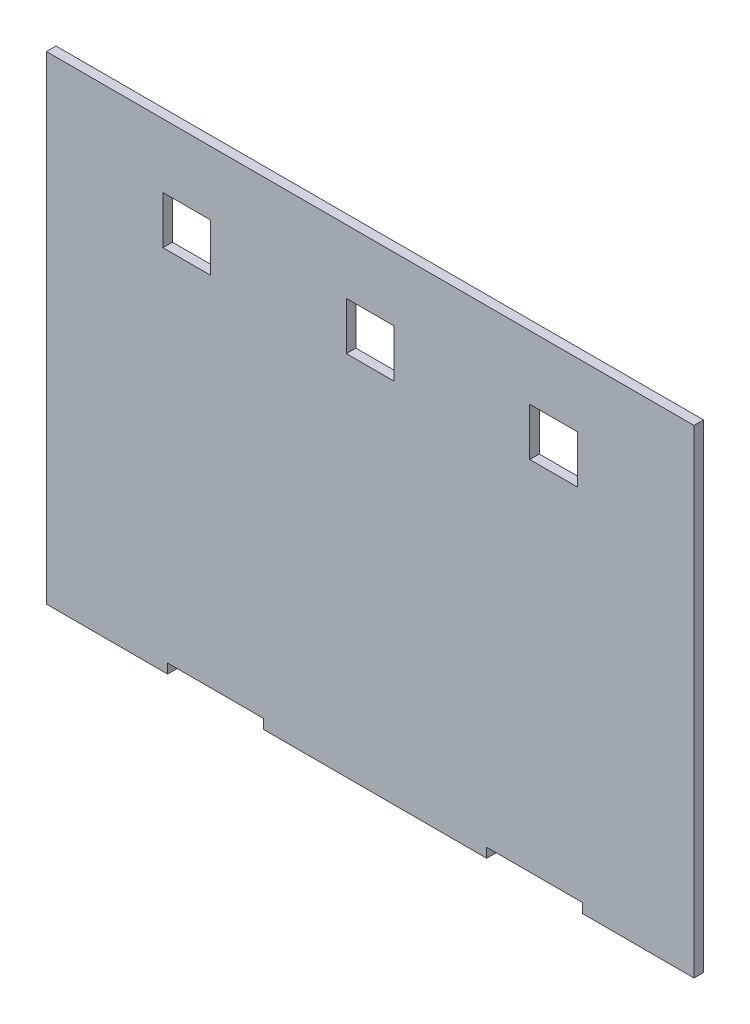
ISO-10303-21;
HEADER;
FILE_DESCRIPTION(('STEP AP214'),'2;1');
FILE_NAME('part.step','',(''),(''),'','','');
FILE_SCHEMA(('AUTOMOTIVE_DESIGN { 1 0 10303 214 1 1 1 1 }'));
ENDSEC;
DATA;
#1=APPLICATION_CONTEXT('core data for automotive mechanical design processes');
#2=APPLICATION_PROTOCOL_DEFINITION('international standard','automotive_design',2000,#1);
#3=PRODUCT_CONTEXT('',#1,'mechanical');
#4=PRODUCT('Part','Part','',(#3));
#5=PRODUCT_RELATED_PRODUCT_CATEGORY('part','',(#4));
#6=PRODUCT_DEFINITION_FORMATION('','',#4);
#7=PRODUCT_DEFINITION_CONTEXT('part definition',#1,'design');
#8=PRODUCT_DEFINITION('design','',#6,#7);
#9=PRODUCT_DEFINITION_SHAPE('','',#8);
#10=(LENGTH_UNIT() NAMED_UNIT(*) SI_UNIT(.MILLI.,.METRE.));
#11=(NAMED_UNIT(*) PLANE_ANGLE_UNIT() SI_UNIT($,.RADIAN.));
#12=(NAMED_UNIT(*) SI_UNIT($,.STERADIAN.) SOLID_ANGLE_UNIT());
#13=UNCERTAINTY_MEASURE_WITH_UNIT(LENGTH_MEASURE(1.E-05),#10,'distance_accuracy_value','');
#14=(GEOMETRIC_REPRESENTATION_CONTEXT(3) GLOBAL_UNCERTAINTY_ASSIGNED_CONTEXT((#13)) GLOBAL_UNIT_ASSIGNED_CONTEXT((#10,
#11,#12)) REPRESENTATION_CONTEXT('',''));
#15=CARTESIAN_POINT('',(0.,0.,0.));
#16=DIRECTION('',(0.,0.,1.));
#17=DIRECTION('',(1.,0.,0.));
#18=AXIS2_PLACEMENT_3D('',#15,#16,#17);
#19=CARTESIAN_POINT('',(-101.5,-75.,3.));
#20=DIRECTION('',(0.,1.,0.));
#21=DIRECTION('',(0.,0.,1.));
#22=AXIS2_PLACEMENT_3D('',#19,#20,#21);
#23=PLANE('',#22);
#24=DIRECTION('',(1.,0.,0.));
#25=VECTOR('',#24,1.);
#26=CARTESIAN_POINT('',(-101.5,-75.,0.));
#27=LINE('',#26,#25);
#28=CARTESIAN_POINT('',(-101.5,-75.,0.));
#29=VERTEX_POINT('',#28);
#30=CARTESIAN_POINT('',(-63.5,-75.,0.));
#31=VERTEX_POINT('',#30);
#32=EDGE_CURVE('E219',#29,#31,#27,.T.);
#33=ORIENTED_EDGE('',*,*,#32,.T.);
#34=DIRECTION('',(0.,0.,1.));
#35=VECTOR('',#34,1.);
#36=CARTESIAN_POINT('',(-63.5,-75.,-7.));
#37=LINE('',#36,#35);
#38=CARTESIAN_POINT('',(-63.5,-75.,3.));
#39=VERTEX_POINT('',#38);
#40=EDGE_CURVE('E202',#31,#39,#37,.T.);
#41=ORIENTED_EDGE('',*,*,#40,.T.);
#42=DIRECTION('',(1.,0.,0.));
#43=VECTOR('',#42,1.);
#44=CARTESIAN_POINT('',(-101.5,-75.,3.));
#45=LINE('',#44,#43);
#46=CARTESIAN_POINT('',(-101.5,-75.,3.));
#47=VERTEX_POINT('',#46);
#48=EDGE_CURVE('E217',#47,#39,#45,.T.);
#49=ORIENTED_EDGE('',*,*,#48,.F.);
#50=DIRECTION('',(0.,0.,-1.));
#51=VECTOR('',#50,1.);
#52=CARTESIAN_POINT('',(-101.5,-75.,3.));
#53=LINE('',#52,#51);
#54=EDGE_CURVE('E237',#47,#29,#53,.T.);
#55=ORIENTED_EDGE('',*,*,#54,.T.);
#56=EDGE_LOOP('',(#33,#41,#49,#55));
#57=FACE_BOUND('',#56,.T.);
#58=ADVANCED_FACE('F38',(#57),#23,.F.);
#59=CARTESIAN_POINT('',(-33.5,-75.,3.));
#60=VERTEX_POINT('',#59);
#61=CARTESIAN_POINT('',(36.5,-74.9999999999999,3.));
#62=VERTEX_POINT('',#61);
#63=EDGE_CURVE('E231',#60,#62,#45,.T.);
#64=ORIENTED_EDGE('',*,*,#63,.F.);
#65=DIRECTION('',(0.,0.,1.));
#66=VECTOR('',#65,1.);
#67=CARTESIAN_POINT('',(-33.5,-75.,-7.));
#68=LINE('',#67,#66);
#69=CARTESIAN_POINT('',(-33.5,-75.,0.));
#70=VERTEX_POINT('',#69);
#71=EDGE_CURVE('E221',#70,#60,#68,.T.);
#72=ORIENTED_EDGE('',*,*,#71,.F.);
#73=CARTESIAN_POINT('',(36.5,-74.9999999999999,0.));
#74=VERTEX_POINT('',#73);
#75=EDGE_CURVE('E433',#70,#74,#27,.T.);
#76=ORIENTED_EDGE('',*,*,#75,.T.);
#77=DIRECTION('',(0.,0.,1.));
#78=VECTOR('',#77,1.);
#79=CARTESIAN_POINT('',(36.5,-74.9999999999999,-7.));
#80=LINE('',#79,#78);
#81=EDGE_CURVE('E211',#74,#62,#80,.T.);
#82=ORIENTED_EDGE('',*,*,#81,.T.);
#83=EDGE_LOOP('',(#64,#72,#76,#82));
#84=FACE_BOUND('',#83,.T.);
#85=ADVANCED_FACE('F489',(#84),#23,.F.);
#86=CARTESIAN_POINT('',(101.5,75.,3.));
#87=DIRECTION('',(-1.,0.,0.));
#88=DIRECTION('',(0.,-1.,0.));
#89=AXIS2_PLACEMENT_3D('',#86,#87,#88);
#90=PLANE('',#89);
#91=DIRECTION('',(0.,1.,0.));
#92=VECTOR('',#91,1.);
#93=CARTESIAN_POINT('',(101.5,75.,0.));
#94=LINE('',#93,#92);
#95=CARTESIAN_POINT('',(101.5,-75.,0.));
#96=VERTEX_POINT('',#95);
#97=CARTESIAN_POINT('',(101.5,75.,0.));
#98=VERTEX_POINT('',#97);
#99=EDGE_CURVE('E358',#96,#98,#94,.T.);
#100=ORIENTED_EDGE('',*,*,#99,.T.);
#101=DIRECTION('',(0.,0.,-1.));
#102=VECTOR('',#101,1.);
#103=CARTESIAN_POINT('',(101.5,75.,3.));
#104=LINE('',#103,#102);
#105=CARTESIAN_POINT('',(101.5,75.,3.));
#106=VERTEX_POINT('',#105);
#107=EDGE_CURVE('E448',#106,#98,#104,.T.);
#108=ORIENTED_EDGE('',*,*,#107,.F.);
#109=DIRECTION('',(0.,1.,0.));
#110=VECTOR('',#109,1.);
#111=CARTESIAN_POINT('',(101.5,75.,3.));
#112=LINE('',#111,#110);
#113=CARTESIAN_POINT('',(101.5,-75.,3.));
#114=VERTEX_POINT('',#113);
#115=EDGE_CURVE('E250',#114,#106,#112,.T.);
#116=ORIENTED_EDGE('',*,*,#115,.F.);
#117=DIRECTION('',(0.,0.,-1.));
#118=VECTOR('',#117,1.);
#119=CARTESIAN_POINT('',(101.5,-75.,3.));
#120=LINE('',#119,#118);
#121=EDGE_CURVE('E230',#114,#96,#120,.T.);
#122=ORIENTED_EDGE('',*,*,#121,.T.);
#123=EDGE_LOOP('',(#100,#108,#116,#122));
#124=FACE_BOUND('',#123,.T.);
#125=ADVANCED_FACE('F40',(#124),#90,.F.);
#126=CARTESIAN_POINT('',(-101.5,75.,3.));
#127=DIRECTION('',(0.,-1.,0.));
#128=DIRECTION('',(0.,0.,-1.));
#129=AXIS2_PLACEMENT_3D('',#126,#127,#128);
#130=PLANE('',#129);
#131=DIRECTION('',(-1.,0.,0.));
#132=VECTOR('',#131,1.);
#133=CARTESIAN_POINT('',(-101.5,75.,0.));
#134=LINE('',#133,#132);
#135=CARTESIAN_POINT('',(-101.5,75.,0.));
#136=VERTEX_POINT('',#135);
#137=EDGE_CURVE('E464',#98,#136,#134,.T.);
#138=ORIENTED_EDGE('',*,*,#137,.T.);
#139=DIRECTION('',(0.,0.,-1.));
#140=VECTOR('',#139,1.);
#141=CARTESIAN_POINT('',(-101.5,75.,3.));
#142=LINE('',#141,#140);
#143=CARTESIAN_POINT('',(-101.5,75.,3.));
#144=VERTEX_POINT('',#143);
#145=EDGE_CURVE('E452',#144,#136,#142,.T.);
#146=ORIENTED_EDGE('',*,*,#145,.F.);
#147=DIRECTION('',(-1.,0.,0.));
#148=VECTOR('',#147,1.);
#149=CARTESIAN_POINT('',(-101.5,75.,3.));
#150=LINE('',#149,#148);
#151=EDGE_CURVE('E248',#106,#144,#150,.T.);
#152=ORIENTED_EDGE('',*,*,#151,.F.);
#153=ORIENTED_EDGE('',*,*,#107,.T.);
#154=EDGE_LOOP('',(#138,#146,#152,#153));
#155=FACE_BOUND('',#154,.T.);
#156=ADVANCED_FACE('F476',(#155),#130,.F.);
#157=CARTESIAN_POINT('',(-101.5,75.,3.));
#158=DIRECTION('',(1.,0.,0.));
#159=DIRECTION('',(0.,1.,0.));
#160=AXIS2_PLACEMENT_3D('',#157,#158,#159);
#161=PLANE('',#160);
#162=DIRECTION('',(0.,-1.,0.));
#163=VECTOR('',#162,1.);
#164=CARTESIAN_POINT('',(-101.5,75.,0.));
#165=LINE('',#164,#163);
#166=EDGE_CURVE('E461',#136,#29,#165,.T.);
#167=ORIENTED_EDGE('',*,*,#166,.T.);
#168=ORIENTED_EDGE('',*,*,#54,.F.);
#169=DIRECTION('',(0.,-1.,0.));
#170=VECTOR('',#169,1.);
#171=CARTESIAN_POINT('',(-101.5,75.,3.));
#172=LINE('',#171,#170);
#173=EDGE_CURVE('E227',#144,#47,#172,.T.);
#174=ORIENTED_EDGE('',*,*,#173,.F.);
#175=ORIENTED_EDGE('',*,*,#145,.T.);
#176=EDGE_LOOP('',(#167,#168,#174,#175));
#177=FACE_BOUND('',#176,.T.);
#178=ADVANCED_FACE('F478',(#177),#161,.F.);
#179=CARTESIAN_POINT('',(66.5,-74.9999999999999,3.));
#180=VERTEX_POINT('',#179);
#181=EDGE_CURVE('E233',#180,#114,#45,.T.);
#182=ORIENTED_EDGE('',*,*,#181,.F.);
#183=DIRECTION('',(0.,0.,1.));
#184=VECTOR('',#183,1.);
#185=CARTESIAN_POINT('',(66.5,-74.9999999999999,-7.));
#186=LINE('',#185,#184);
#187=CARTESIAN_POINT('',(66.5,-74.9999999999999,0.));
#188=VERTEX_POINT('',#187);
#189=EDGE_CURVE('E388',#188,#180,#186,.T.);
#190=ORIENTED_EDGE('',*,*,#189,.F.);
#191=EDGE_CURVE('E460',#188,#96,#27,.T.);
#192=ORIENTED_EDGE('',*,*,#191,.T.);
#193=ORIENTED_EDGE('',*,*,#121,.F.);
#194=EDGE_LOOP('',(#182,#190,#192,#193));
#195=FACE_BOUND('',#194,.T.);
#196=ADVANCED_FACE('F480',(#195),#23,.F.);
#197=CARTESIAN_POINT('',(0.,0.,3.));
#198=DIRECTION('',(0.,0.,1.));
#199=DIRECTION('',(1.,0.,0.));
#200=AXIS2_PLACEMENT_3D('',#197,#198,#199);
#201=PLANE('',#200);
#202=DIRECTION('',(0.,-1.,0.));
#203=VECTOR('',#202,1.);
#204=CARTESIAN_POINT('',(-63.5,-75.,3.));
#205=LINE('',#204,#203);
#206=CARTESIAN_POINT('',(-63.5,-72.0000000000002,3.));
#207=VERTEX_POINT('',#206);
#208=EDGE_CURVE('E199',#207,#39,#205,.T.);
#209=ORIENTED_EDGE('',*,*,#208,.F.);
#210=DIRECTION('',(-1.,0.,0.));
#211=VECTOR('',#210,1.);
#212=CARTESIAN_POINT('',(-63.5,-72.0000000000002,3.));
#213=LINE('',#212,#211);
#214=CARTESIAN_POINT('',(-33.5,-72.0000000000002,3.));
#215=VERTEX_POINT('',#214);
#216=EDGE_CURVE('E222',#215,#207,#213,.T.);
#217=ORIENTED_EDGE('',*,*,#216,.F.);
#218=DIRECTION('',(0.,1.,0.));
#219=VECTOR('',#218,1.);
#220=CARTESIAN_POINT('',(-33.5,-75.,3.));
#221=LINE('',#220,#219);
#222=EDGE_CURVE('E210',#60,#215,#221,.T.);
#223=ORIENTED_EDGE('',*,*,#222,.F.);
#224=ORIENTED_EDGE('',*,*,#63,.T.);
#225=DIRECTION('',(0.,-1.,0.));
#226=VECTOR('',#225,1.);
#227=CARTESIAN_POINT('',(36.5,-74.9999999999999,3.));
#228=LINE('',#227,#226);
#229=CARTESIAN_POINT('',(36.5,-72.0000000000001,3.));
#230=VERTEX_POINT('',#229);
#231=EDGE_CURVE('E391',#230,#62,#228,.T.);
#232=ORIENTED_EDGE('',*,*,#231,.F.);
#233=DIRECTION('',(-1.,0.,0.));
#234=VECTOR('',#233,1.);
#235=CARTESIAN_POINT('',(36.5,-72.0000000000001,3.));
#236=LINE('',#235,#234);
#237=CARTESIAN_POINT('',(66.5,-72.0000000000001,3.));
#238=VERTEX_POINT('',#237);
#239=EDGE_CURVE('E402',#238,#230,#236,.T.);
#240=ORIENTED_EDGE('',*,*,#239,.F.);
#241=DIRECTION('',(0.,1.,0.));
#242=VECTOR('',#241,1.);
#243=CARTESIAN_POINT('',(66.5,-74.9999999999999,3.));
#244=LINE('',#243,#242);
#245=EDGE_CURVE('E406',#180,#238,#244,.T.);
#246=ORIENTED_EDGE('',*,*,#245,.F.);
#247=ORIENTED_EDGE('',*,*,#181,.T.);
#248=ORIENTED_EDGE('',*,*,#115,.T.);
#249=ORIENTED_EDGE('',*,*,#151,.T.);
#250=ORIENTED_EDGE('',*,*,#173,.T.);
#251=ORIENTED_EDGE('',*,*,#48,.T.);
#252=EDGE_LOOP('',(#209,#217,#223,#224,#232,#240,#246,#247,#248,#249,#250,#251));
#253=FACE_BOUND('',#252,.T.);
#254=DIRECTION('',(0.,-1.,0.));
#255=VECTOR('',#254,1.);
#256=CARTESIAN_POINT('',(-65.,55.,3.));
#257=LINE('',#256,#255);
#258=CARTESIAN_POINT('',(-65.,55.,3.));
#259=VERTEX_POINT('',#258);
#260=CARTESIAN_POINT('',(-65.,40.,3.));
#261=VERTEX_POINT('',#260);
#262=EDGE_CURVE('E314',#259,#261,#257,.T.);
#263=ORIENTED_EDGE('',*,*,#262,.F.);
#264=DIRECTION('',(-1.,0.,0.));
#265=VECTOR('',#264,1.);
#266=CARTESIAN_POINT('',(-65.,55.,3.));
#267=LINE('',#266,#265);
#268=CARTESIAN_POINT('',(-50.,55.,3.));
#269=VERTEX_POINT('',#268);
#270=EDGE_CURVE('E359',#269,#259,#267,.T.);
#271=ORIENTED_EDGE('',*,*,#270,.F.);
#272=DIRECTION('',(0.,1.,0.));
#273=VECTOR('',#272,1.);
#274=CARTESIAN_POINT('',(-50.,55.,3.));
#275=LINE('',#274,#273);
#276=CARTESIAN_POINT('',(-50.,40.,3.));
#277=VERTEX_POINT('',#276);
#278=EDGE_CURVE('E364',#277,#269,#275,.T.);
#279=ORIENTED_EDGE('',*,*,#278,.F.);
#280=DIRECTION('',(1.,0.,0.));
#281=VECTOR('',#280,1.);
#282=CARTESIAN_POINT('',(-65.,40.,3.));
#283=LINE('',#282,#281);
#284=EDGE_CURVE('E368',#261,#277,#283,.T.);
#285=ORIENTED_EDGE('',*,*,#284,.F.);
#286=EDGE_LOOP('',(#263,#271,#279,#285));
#287=FACE_BOUND('',#286,.T.);
#288=DIRECTION('',(0.,1.,0.));
#289=VECTOR('',#288,1.);
#290=CARTESIAN_POINT('',(65.,55.,3.));
#291=LINE('',#290,#289);
#292=CARTESIAN_POINT('',(65.,40.,3.));
#293=VERTEX_POINT('',#292);
#294=CARTESIAN_POINT('',(65.,55.,3.));
#295=VERTEX_POINT('',#294);
#296=EDGE_CURVE('E269',#293,#295,#291,.T.);
#297=ORIENTED_EDGE('',*,*,#296,.F.);
#298=DIRECTION('',(1.,0.,0.));
#299=VECTOR('',#298,1.);
#300=CARTESIAN_POINT('',(65.,40.,3.));
#301=LINE('',#300,#299);
#302=CARTESIAN_POINT('',(50.,40.,3.));
#303=VERTEX_POINT('',#302);
#304=EDGE_CURVE('E315',#303,#293,#301,.T.);
#305=ORIENTED_EDGE('',*,*,#304,.F.);
#306=DIRECTION('',(0.,-1.,0.));
#307=VECTOR('',#306,1.);
#308=CARTESIAN_POINT('',(50.,55.,3.));
#309=LINE('',#308,#307);
#310=CARTESIAN_POINT('',(50.,55.,3.));
#311=VERTEX_POINT('',#310);
#312=EDGE_CURVE('E320',#311,#303,#309,.T.);
#313=ORIENTED_EDGE('',*,*,#312,.F.);
#314=DIRECTION('',(-1.,0.,0.));
#315=VECTOR('',#314,1.);
#316=CARTESIAN_POINT('',(65.,55.,3.));
#317=LINE('',#316,#315);
#318=EDGE_CURVE('E324',#295,#311,#317,.T.);
#319=ORIENTED_EDGE('',*,*,#318,.F.);
#320=EDGE_LOOP('',(#297,#305,#313,#319));
#321=FACE_BOUND('',#320,.T.);
#322=DIRECTION('',(0.,1.,0.));
#323=VECTOR('',#322,1.);
#324=CARTESIAN_POINT('',(7.49999999999999,55.,3.));
#325=LINE('',#324,#323);
#326=CARTESIAN_POINT('',(7.49999999999999,40.,3.));
#327=VERTEX_POINT('',#326);
#328=CARTESIAN_POINT('',(7.49999999999999,55.,3.));
#329=VERTEX_POINT('',#328);
#330=EDGE_CURVE('E283',#327,#329,#325,.T.);
#331=ORIENTED_EDGE('',*,*,#330,.F.);
#332=DIRECTION('',(1.,0.,0.));
#333=VECTOR('',#332,1.);
#334=CARTESIAN_POINT('',(-7.50000000000001,40.,3.));
#335=LINE('',#334,#333);
#336=CARTESIAN_POINT('',(-7.50000000000001,40.,3.));
#337=VERTEX_POINT('',#336);
#338=EDGE_CURVE('E270',#337,#327,#335,.T.);
#339=ORIENTED_EDGE('',*,*,#338,.F.);
#340=DIRECTION('',(0.,-1.,0.));
#341=VECTOR('',#340,1.);
#342=CARTESIAN_POINT('',(-7.50000000000001,55.,3.));
#343=LINE('',#342,#341);
#344=CARTESIAN_POINT('',(-7.50000000000001,55.,3.));
#345=VERTEX_POINT('',#344);
#346=EDGE_CURVE('E275',#345,#337,#343,.T.);
#347=ORIENTED_EDGE('',*,*,#346,.F.);
#348=DIRECTION('',(-1.,0.,0.));
#349=VECTOR('',#348,1.);
#350=CARTESIAN_POINT('',(-7.50000000000001,55.,3.));
#351=LINE('',#350,#349);
#352=EDGE_CURVE('E279',#329,#345,#351,.T.);
#353=ORIENTED_EDGE('',*,*,#352,.F.);
#354=EDGE_LOOP('',(#331,#339,#347,#353));
#355=FACE_BOUND('',#354,.T.);
#356=ADVANCED_FACE('F224',(#253,#287,#321,#355),#201,.T.);
#357=CARTESIAN_POINT('',(0.,0.,0.));
#358=DIRECTION('',(0.,0.,1.));
#359=DIRECTION('',(1.,0.,0.));
#360=AXIS2_PLACEMENT_3D('',#357,#358,#359);
#361=PLANE('',#360);
#362=DIRECTION('',(-1.,0.,0.));
#363=VECTOR('',#362,1.);
#364=CARTESIAN_POINT('',(-65.,55.,0.));
#365=LINE('',#364,#363);
#366=CARTESIAN_POINT('',(-50.,55.,0.));
#367=VERTEX_POINT('',#366);
#368=CARTESIAN_POINT('',(-65.,55.,0.));
#369=VERTEX_POINT('',#368);
#370=EDGE_CURVE('E349',#367,#369,#365,.T.);
#371=ORIENTED_EDGE('',*,*,#370,.T.);
#372=DIRECTION('',(0.,-1.,0.));
#373=VECTOR('',#372,1.);
#374=CARTESIAN_POINT('',(-65.,55.,0.));
#375=LINE('',#374,#373);
#376=CARTESIAN_POINT('',(-65.,40.,0.));
#377=VERTEX_POINT('',#376);
#378=EDGE_CURVE('E363',#369,#377,#375,.T.);
#379=ORIENTED_EDGE('',*,*,#378,.T.);
#380=DIRECTION('',(1.,0.,0.));
#381=VECTOR('',#380,1.);
#382=CARTESIAN_POINT('',(-65.,40.,0.));
#383=LINE('',#382,#381);
#384=CARTESIAN_POINT('',(-50.,40.,0.));
#385=VERTEX_POINT('',#384);
#386=EDGE_CURVE('E381',#377,#385,#383,.T.);
#387=ORIENTED_EDGE('',*,*,#386,.T.);
#388=DIRECTION('',(0.,1.,0.));
#389=VECTOR('',#388,1.);
#390=CARTESIAN_POINT('',(-50.,55.,0.));
#391=LINE('',#390,#389);
#392=EDGE_CURVE('E377',#385,#367,#391,.T.);
#393=ORIENTED_EDGE('',*,*,#392,.T.);
#394=EDGE_LOOP('',(#371,#379,#387,#393));
#395=FACE_BOUND('',#394,.T.);
#396=DIRECTION('',(1.,0.,0.));
#397=VECTOR('',#396,1.);
#398=CARTESIAN_POINT('',(65.,40.,0.));
#399=LINE('',#398,#397);
#400=CARTESIAN_POINT('',(50.,40.,0.));
#401=VERTEX_POINT('',#400);
#402=CARTESIAN_POINT('',(65.,40.,0.));
#403=VERTEX_POINT('',#402);
#404=EDGE_CURVE('E305',#401,#403,#399,.T.);
#405=ORIENTED_EDGE('',*,*,#404,.T.);
#406=DIRECTION('',(0.,1.,0.));
#407=VECTOR('',#406,1.);
#408=CARTESIAN_POINT('',(65.,55.,0.));
#409=LINE('',#408,#407);
#410=CARTESIAN_POINT('',(65.,55.,0.));
#411=VERTEX_POINT('',#410);
#412=EDGE_CURVE('E319',#403,#411,#409,.T.);
#413=ORIENTED_EDGE('',*,*,#412,.T.);
#414=DIRECTION('',(-1.,0.,0.));
#415=VECTOR('',#414,1.);
#416=CARTESIAN_POINT('',(65.,55.,0.));
#417=LINE('',#416,#415);
#418=CARTESIAN_POINT('',(50.,55.,0.));
#419=VERTEX_POINT('',#418);
#420=EDGE_CURVE('E337',#411,#419,#417,.T.);
#421=ORIENTED_EDGE('',*,*,#420,.T.);
#422=DIRECTION('',(0.,-1.,0.));
#423=VECTOR('',#422,1.);
#424=CARTESIAN_POINT('',(50.,55.,0.));
#425=LINE('',#424,#423);
#426=EDGE_CURVE('E333',#419,#401,#425,.T.);
#427=ORIENTED_EDGE('',*,*,#426,.T.);
#428=EDGE_LOOP('',(#405,#413,#421,#427));
#429=FACE_BOUND('',#428,.T.);
#430=DIRECTION('',(1.,0.,0.));
#431=VECTOR('',#430,1.);
#432=CARTESIAN_POINT('',(-7.50000000000001,40.,0.));
#433=LINE('',#432,#431);
#434=CARTESIAN_POINT('',(-7.50000000000001,40.,0.));
#435=VERTEX_POINT('',#434);
#436=CARTESIAN_POINT('',(7.49999999999999,40.,0.));
#437=VERTEX_POINT('',#436);
#438=EDGE_CURVE('E260',#435,#437,#433,.T.);
#439=ORIENTED_EDGE('',*,*,#438,.T.);
#440=DIRECTION('',(0.,1.,0.));
#441=VECTOR('',#440,1.);
#442=CARTESIAN_POINT('',(7.49999999999999,55.,0.));
#443=LINE('',#442,#441);
#444=CARTESIAN_POINT('',(7.49999999999999,55.,0.));
#445=VERTEX_POINT('',#444);
#446=EDGE_CURVE('E274',#437,#445,#443,.T.);
#447=ORIENTED_EDGE('',*,*,#446,.T.);
#448=DIRECTION('',(-1.,0.,0.));
#449=VECTOR('',#448,1.);
#450=CARTESIAN_POINT('',(-7.50000000000001,55.,0.));
#451=LINE('',#450,#449);
#452=CARTESIAN_POINT('',(-7.50000000000001,55.,0.));
#453=VERTEX_POINT('',#452);
#454=EDGE_CURVE('E293',#445,#453,#451,.T.);
#455=ORIENTED_EDGE('',*,*,#454,.T.);
#456=DIRECTION('',(0.,-1.,0.));
#457=VECTOR('',#456,1.);
#458=CARTESIAN_POINT('',(-7.50000000000001,55.,0.));
#459=LINE('',#458,#457);
#460=EDGE_CURVE('E289',#453,#435,#459,.T.);
#461=ORIENTED_EDGE('',*,*,#460,.T.);
#462=EDGE_LOOP('',(#439,#447,#455,#461));
#463=FACE_BOUND('',#462,.T.);
#464=DIRECTION('',(-1.,0.,0.));
#465=VECTOR('',#464,1.);
#466=CARTESIAN_POINT('',(0.,-72.0000000000002,0.));
#467=LINE('',#466,#465);
#468=CARTESIAN_POINT('',(-33.5,-72.0000000000002,0.));
#469=VERTEX_POINT('',#468);
#470=CARTESIAN_POINT('',(-63.5,-72.0000000000002,0.));
#471=VERTEX_POINT('',#470);
#472=EDGE_CURVE('E47',#469,#471,#467,.T.);
#473=ORIENTED_EDGE('',*,*,#472,.T.);
#474=DIRECTION('',(0.,-1.,0.));
#475=VECTOR('',#474,1.);
#476=CARTESIAN_POINT('',(-63.5,0.,0.));
#477=LINE('',#476,#475);
#478=EDGE_CURVE('E11',#471,#31,#477,.T.);
#479=ORIENTED_EDGE('',*,*,#478,.T.);
#480=ORIENTED_EDGE('',*,*,#32,.F.);
#481=ORIENTED_EDGE('',*,*,#166,.F.);
#482=ORIENTED_EDGE('',*,*,#137,.F.);
#483=ORIENTED_EDGE('',*,*,#99,.F.);
#484=ORIENTED_EDGE('',*,*,#191,.F.);
#485=DIRECTION('',(0.,1.,0.));
#486=VECTOR('',#485,1.);
#487=CARTESIAN_POINT('',(66.5,0.,0.));
#488=LINE('',#487,#486);
#489=CARTESIAN_POINT('',(66.5,-72.0000000000001,0.));
#490=VERTEX_POINT('',#489);
#491=EDGE_CURVE('E444',#188,#490,#488,.T.);
#492=ORIENTED_EDGE('',*,*,#491,.T.);
#493=DIRECTION('',(-1.,0.,0.));
#494=VECTOR('',#493,1.);
#495=CARTESIAN_POINT('',(0.,-72.0000000000001,0.));
#496=LINE('',#495,#494);
#497=CARTESIAN_POINT('',(36.5,-72.0000000000001,0.));
#498=VERTEX_POINT('',#497);
#499=EDGE_CURVE('E438',#490,#498,#496,.T.);
#500=ORIENTED_EDGE('',*,*,#499,.T.);
#501=DIRECTION('',(0.,-1.,0.));
#502=VECTOR('',#501,1.);
#503=CARTESIAN_POINT('',(36.5,0.,0.));
#504=LINE('',#503,#502);
#505=EDGE_CURVE('E435',#498,#74,#504,.T.);
#506=ORIENTED_EDGE('',*,*,#505,.T.);
#507=ORIENTED_EDGE('',*,*,#75,.F.);
#508=DIRECTION('',(0.,1.,0.));
#509=VECTOR('',#508,1.);
#510=CARTESIAN_POINT('',(-33.5,0.,0.));
#511=LINE('',#510,#509);
#512=EDGE_CURVE('E428',#70,#469,#511,.T.);
#513=ORIENTED_EDGE('',*,*,#512,.T.);
#514=EDGE_LOOP('',(#473,#479,#480,#481,#482,#483,#484,#492,#500,#506,#507,#513));
#515=FACE_BOUND('',#514,.T.);
#516=ADVANCED_FACE('F430',(#395,#429,#463,#515),#361,.F.);
#517=CARTESIAN_POINT('',(7.49999999999999,55.,0.));
#518=DIRECTION('',(1.,0.,0.));
#519=DIRECTION('',(0.,1.,0.));
#520=AXIS2_PLACEMENT_3D('',#517,#518,#519);
#521=PLANE('',#520);
#522=ORIENTED_EDGE('',*,*,#330,.T.);
#523=DIRECTION('',(0.,0.,1.));
#524=VECTOR('',#523,1.);
#525=CARTESIAN_POINT('',(7.49999999999999,55.,0.));
#526=LINE('',#525,#524);
#527=EDGE_CURVE('E255',#445,#329,#526,.T.);
#528=ORIENTED_EDGE('',*,*,#527,.F.);
#529=ORIENTED_EDGE('',*,*,#446,.F.);
#530=DIRECTION('',(0.,0.,1.));
#531=VECTOR('',#530,1.);
#532=CARTESIAN_POINT('',(7.49999999999999,40.,0.));
#533=LINE('',#532,#531);
#534=EDGE_CURVE('E266',#437,#327,#533,.T.);
#535=ORIENTED_EDGE('',*,*,#534,.T.);
#536=EDGE_LOOP('',(#522,#528,#529,#535));
#537=FACE_BOUND('',#536,.T.);
#538=ADVANCED_FACE('F499',(#537),#521,.F.);
#539=CARTESIAN_POINT('',(-7.50000000000001,40.,0.));
#540=DIRECTION('',(0.,-1.,0.));
#541=DIRECTION('',(0.,0.,-1.));
#542=AXIS2_PLACEMENT_3D('',#539,#540,#541);
#543=PLANE('',#542);
#544=ORIENTED_EDGE('',*,*,#338,.T.);
#545=ORIENTED_EDGE('',*,*,#534,.F.);
#546=ORIENTED_EDGE('',*,*,#438,.F.);
#547=DIRECTION('',(0.,0.,1.));
#548=VECTOR('',#547,1.);
#549=CARTESIAN_POINT('',(-7.50000000000001,40.,0.));
#550=LINE('',#549,#548);
#551=EDGE_CURVE('E263',#435,#337,#550,.T.);
#552=ORIENTED_EDGE('',*,*,#551,.T.);
#553=EDGE_LOOP('',(#544,#545,#546,#552));
#554=FACE_BOUND('',#553,.T.);
#555=ADVANCED_FACE('F505',(#554),#543,.F.);
#556=CARTESIAN_POINT('',(-7.50000000000001,55.,0.));
#557=DIRECTION('',(-1.,0.,0.));
#558=DIRECTION('',(0.,-1.,0.));
#559=AXIS2_PLACEMENT_3D('',#556,#557,#558);
#560=PLANE('',#559);
#561=ORIENTED_EDGE('',*,*,#346,.T.);
#562=ORIENTED_EDGE('',*,*,#551,.F.);
#563=ORIENTED_EDGE('',*,*,#460,.F.);
#564=DIRECTION('',(0.,0.,1.));
#565=VECTOR('',#564,1.);
#566=CARTESIAN_POINT('',(-7.50000000000001,55.,0.));
#567=LINE('',#566,#565);
#568=EDGE_CURVE('E259',#453,#345,#567,.T.);
#569=ORIENTED_EDGE('',*,*,#568,.T.);
#570=EDGE_LOOP('',(#561,#562,#563,#569));
#571=FACE_BOUND('',#570,.T.);
#572=ADVANCED_FACE('F511',(#571),#560,.F.);
#573=CARTESIAN_POINT('',(-7.50000000000001,55.,0.));
#574=DIRECTION('',(0.,1.,0.));
#575=DIRECTION('',(0.,0.,1.));
#576=AXIS2_PLACEMENT_3D('',#573,#574,#575);
#577=PLANE('',#576);
#578=ORIENTED_EDGE('',*,*,#352,.T.);
#579=ORIENTED_EDGE('',*,*,#568,.F.);
#580=ORIENTED_EDGE('',*,*,#454,.F.);
#581=ORIENTED_EDGE('',*,*,#527,.T.);
#582=EDGE_LOOP('',(#578,#579,#580,#581));
#583=FACE_BOUND('',#582,.T.);
#584=ADVANCED_FACE('F507',(#583),#577,.F.);
#585=CARTESIAN_POINT('',(65.,55.,0.));
#586=DIRECTION('',(1.,0.,0.));
#587=DIRECTION('',(0.,0.,-1.));
#588=AXIS2_PLACEMENT_3D('',#585,#586,#587);
#589=PLANE('',#588);
#590=ORIENTED_EDGE('',*,*,#296,.T.);
#591=DIRECTION('',(0.,0.,1.));
#592=VECTOR('',#591,1.);
#593=CARTESIAN_POINT('',(65.,55.,0.));
#594=LINE('',#593,#592);
#595=EDGE_CURVE('E300',#411,#295,#594,.T.);
#596=ORIENTED_EDGE('',*,*,#595,.F.);
#597=ORIENTED_EDGE('',*,*,#412,.F.);
#598=DIRECTION('',(0.,0.,1.));
#599=VECTOR('',#598,1.);
#600=CARTESIAN_POINT('',(65.,40.,0.));
#601=LINE('',#600,#599);
#602=EDGE_CURVE('E311',#403,#293,#601,.T.);
#603=ORIENTED_EDGE('',*,*,#602,.T.);
#604=EDGE_LOOP('',(#590,#596,#597,#603));
#605=FACE_BOUND('',#604,.T.);
#606=ADVANCED_FACE('F510',(#605),#589,.F.);
#607=CARTESIAN_POINT('',(65.,40.,0.));
#608=DIRECTION('',(0.,-1.,0.));
#609=DIRECTION('',(1.,0.,0.));
#610=AXIS2_PLACEMENT_3D('',#607,#608,#609);
#611=PLANE('',#610);
#612=ORIENTED_EDGE('',*,*,#304,.T.);
#613=ORIENTED_EDGE('',*,*,#602,.F.);
#614=ORIENTED_EDGE('',*,*,#404,.F.);
#615=DIRECTION('',(0.,0.,1.));
#616=VECTOR('',#615,1.);
#617=CARTESIAN_POINT('',(50.,40.,0.));
#618=LINE('',#617,#616);
#619=EDGE_CURVE('E308',#401,#303,#618,.T.);
#620=ORIENTED_EDGE('',*,*,#619,.T.);
#621=EDGE_LOOP('',(#612,#613,#614,#620));
#622=FACE_BOUND('',#621,.T.);
#623=ADVANCED_FACE('F521',(#622),#611,.F.);
#624=CARTESIAN_POINT('',(50.,55.,0.));
#625=DIRECTION('',(-1.,0.,0.));
#626=DIRECTION('',(0.,0.,1.));
#627=AXIS2_PLACEMENT_3D('',#624,#625,#626);
#628=PLANE('',#627);
#629=ORIENTED_EDGE('',*,*,#312,.T.);
#630=ORIENTED_EDGE('',*,*,#619,.F.);
#631=ORIENTED_EDGE('',*,*,#426,.F.);
#632=DIRECTION('',(0.,0.,1.));
#633=VECTOR('',#632,1.);
#634=CARTESIAN_POINT('',(50.,55.,0.));
#635=LINE('',#634,#633);
#636=EDGE_CURVE('E304',#419,#311,#635,.T.);
#637=ORIENTED_EDGE('',*,*,#636,.T.);
#638=EDGE_LOOP('',(#629,#630,#631,#637));
#639=FACE_BOUND('',#638,.T.);
#640=ADVANCED_FACE('F527',(#639),#628,.F.);
#641=CARTESIAN_POINT('',(65.,55.,0.));
#642=DIRECTION('',(0.,1.,0.));
#643=DIRECTION('',(0.,0.,1.));
#644=AXIS2_PLACEMENT_3D('',#641,#642,#643);
#645=PLANE('',#644);
#646=ORIENTED_EDGE('',*,*,#318,.T.);
#647=ORIENTED_EDGE('',*,*,#636,.F.);
#648=ORIENTED_EDGE('',*,*,#420,.F.);
#649=ORIENTED_EDGE('',*,*,#595,.T.);
#650=EDGE_LOOP('',(#646,#647,#648,#649));
#651=FACE_BOUND('',#650,.T.);
#652=ADVANCED_FACE('F523',(#651),#645,.F.);
#653=CARTESIAN_POINT('',(-65.,55.,0.));
#654=DIRECTION('',(-1.,0.,0.));
#655=DIRECTION('',(0.,0.,1.));
#656=AXIS2_PLACEMENT_3D('',#653,#654,#655);
#657=PLANE('',#656);
#658=ORIENTED_EDGE('',*,*,#262,.T.);
#659=DIRECTION('',(0.,0.,1.));
#660=VECTOR('',#659,1.);
#661=CARTESIAN_POINT('',(-65.,40.,0.));
#662=LINE('',#661,#660);
#663=EDGE_CURVE('E344',#377,#261,#662,.T.);
#664=ORIENTED_EDGE('',*,*,#663,.F.);
#665=ORIENTED_EDGE('',*,*,#378,.F.);
#666=DIRECTION('',(0.,0.,1.));
#667=VECTOR('',#666,1.);
#668=CARTESIAN_POINT('',(-65.,55.,0.));
#669=LINE('',#668,#667);
#670=EDGE_CURVE('E355',#369,#259,#669,.T.);
#671=ORIENTED_EDGE('',*,*,#670,.T.);
#672=EDGE_LOOP('',(#658,#664,#665,#671));
#673=FACE_BOUND('',#672,.T.);
#674=ADVANCED_FACE('F526',(#673),#657,.F.);
#675=CARTESIAN_POINT('',(-65.,55.,0.));
#676=DIRECTION('',(0.,1.,0.));
#677=DIRECTION('',(0.,0.,1.));
#678=AXIS2_PLACEMENT_3D('',#675,#676,#677);
#679=PLANE('',#678);
#680=ORIENTED_EDGE('',*,*,#270,.T.);
#681=ORIENTED_EDGE('',*,*,#670,.F.);
#682=ORIENTED_EDGE('',*,*,#370,.F.);
#683=DIRECTION('',(0.,0.,1.));
#684=VECTOR('',#683,1.);
#685=CARTESIAN_POINT('',(-50.,55.,0.));
#686=LINE('',#685,#684);
#687=EDGE_CURVE('E352',#367,#269,#686,.T.);
#688=ORIENTED_EDGE('',*,*,#687,.T.);
#689=EDGE_LOOP('',(#680,#681,#682,#688));
#690=FACE_BOUND('',#689,.T.);
#691=ADVANCED_FACE('F537',(#690),#679,.F.);
#692=CARTESIAN_POINT('',(-50.,55.,0.));
#693=DIRECTION('',(1.,0.,0.));
#694=DIRECTION('',(0.,0.,-1.));
#695=AXIS2_PLACEMENT_3D('',#692,#693,#694);
#696=PLANE('',#695);
#697=ORIENTED_EDGE('',*,*,#278,.T.);
#698=ORIENTED_EDGE('',*,*,#687,.F.);
#699=ORIENTED_EDGE('',*,*,#392,.F.);
#700=DIRECTION('',(0.,0.,1.));
#701=VECTOR('',#700,1.);
#702=CARTESIAN_POINT('',(-50.,40.,0.));
#703=LINE('',#702,#701);
#704=EDGE_CURVE('E348',#385,#277,#703,.T.);
#705=ORIENTED_EDGE('',*,*,#704,.T.);
#706=EDGE_LOOP('',(#697,#698,#699,#705));
#707=FACE_BOUND('',#706,.T.);
#708=ADVANCED_FACE('F543',(#707),#696,.F.);
#709=CARTESIAN_POINT('',(-65.,40.,0.));
#710=DIRECTION('',(0.,-1.,0.));
#711=DIRECTION('',(1.,0.,0.));
#712=AXIS2_PLACEMENT_3D('',#709,#710,#711);
#713=PLANE('',#712);
#714=ORIENTED_EDGE('',*,*,#284,.T.);
#715=ORIENTED_EDGE('',*,*,#704,.F.);
#716=ORIENTED_EDGE('',*,*,#386,.F.);
#717=ORIENTED_EDGE('',*,*,#663,.T.);
#718=EDGE_LOOP('',(#714,#715,#716,#717));
#719=FACE_BOUND('',#718,.T.);
#720=ADVANCED_FACE('F539',(#719),#713,.F.);
#721=CARTESIAN_POINT('',(36.5,-74.9999999999999,-7.));
#722=DIRECTION('',(-1.,0.,0.));
#723=DIRECTION('',(0.,0.,1.));
#724=AXIS2_PLACEMENT_3D('',#721,#722,#723);
#725=PLANE('',#724);
#726=DIRECTION('',(0.,0.,1.));
#727=VECTOR('',#726,1.);
#728=CARTESIAN_POINT('',(36.5,-72.0000000000001,-7.));
#729=LINE('',#728,#727);
#730=EDGE_CURVE('E394',#498,#230,#729,.T.);
#731=ORIENTED_EDGE('',*,*,#730,.T.);
#732=ORIENTED_EDGE('',*,*,#231,.T.);
#733=ORIENTED_EDGE('',*,*,#81,.F.);
#734=ORIENTED_EDGE('',*,*,#505,.F.);
#735=EDGE_LOOP('',(#731,#732,#733,#734));
#736=FACE_BOUND('',#735,.T.);
#737=ADVANCED_FACE('F542',(#736),#725,.F.);
#738=CARTESIAN_POINT('',(36.5,-72.0000000000001,-7.));
#739=DIRECTION('',(0.,1.,0.));
#740=DIRECTION('',(0.,0.,1.));
#741=AXIS2_PLACEMENT_3D('',#738,#739,#740);
#742=PLANE('',#741);
#743=DIRECTION('',(0.,0.,1.));
#744=VECTOR('',#743,1.);
#745=CARTESIAN_POINT('',(66.5,-72.0000000000001,-7.));
#746=LINE('',#745,#744);
#747=EDGE_CURVE('E62',#490,#238,#746,.T.);
#748=ORIENTED_EDGE('',*,*,#747,.T.);
#749=ORIENTED_EDGE('',*,*,#239,.T.);
#750=ORIENTED_EDGE('',*,*,#730,.F.);
#751=ORIENTED_EDGE('',*,*,#499,.F.);
#752=EDGE_LOOP('',(#748,#749,#750,#751));
#753=FACE_BOUND('',#752,.T.);
#754=ADVANCED_FACE('F554',(#753),#742,.F.);
#755=CARTESIAN_POINT('',(66.5,-74.9999999999999,-7.));
#756=DIRECTION('',(1.,0.,0.));
#757=DIRECTION('',(0.,0.,-1.));
#758=AXIS2_PLACEMENT_3D('',#755,#756,#757);
#759=PLANE('',#758);
#760=ORIENTED_EDGE('',*,*,#189,.T.);
#761=ORIENTED_EDGE('',*,*,#245,.T.);
#762=ORIENTED_EDGE('',*,*,#747,.F.);
#763=ORIENTED_EDGE('',*,*,#491,.F.);
#764=EDGE_LOOP('',(#760,#761,#762,#763));
#765=FACE_BOUND('',#764,.T.);
#766=ADVANCED_FACE('F551',(#765),#759,.F.);
#767=CARTESIAN_POINT('',(-63.5,-75.,-7.));
#768=DIRECTION('',(-1.,0.,0.));
#769=DIRECTION('',(0.,0.,1.));
#770=AXIS2_PLACEMENT_3D('',#767,#768,#769);
#771=PLANE('',#770);
#772=DIRECTION('',(0.,0.,1.));
#773=VECTOR('',#772,1.);
#774=CARTESIAN_POINT('',(-63.5,-72.0000000000002,-7.));
#775=LINE('',#774,#773);
#776=EDGE_CURVE('E204',#471,#207,#775,.T.);
#777=ORIENTED_EDGE('',*,*,#776,.T.);
#778=ORIENTED_EDGE('',*,*,#208,.T.);
#779=ORIENTED_EDGE('',*,*,#40,.F.);
#780=ORIENTED_EDGE('',*,*,#478,.F.);
#781=EDGE_LOOP('',(#777,#778,#779,#780));
#782=FACE_BOUND('',#781,.T.);
#783=ADVANCED_FACE('F201',(#782),#771,.F.);
#784=CARTESIAN_POINT('',(-63.5,-72.0000000000002,-7.));
#785=DIRECTION('',(0.,1.,0.));
#786=DIRECTION('',(0.,0.,1.));
#787=AXIS2_PLACEMENT_3D('',#784,#785,#786);
#788=PLANE('',#787);
#789=DIRECTION('',(0.,0.,1.));
#790=VECTOR('',#789,1.);
#791=CARTESIAN_POINT('',(-33.5,-72.0000000000002,-7.));
#792=LINE('',#791,#790);
#793=EDGE_CURVE('E54',#469,#215,#792,.T.);
#794=ORIENTED_EDGE('',*,*,#793,.T.);
#795=ORIENTED_EDGE('',*,*,#216,.T.);
#796=ORIENTED_EDGE('',*,*,#776,.F.);
#797=ORIENTED_EDGE('',*,*,#472,.F.);
#798=EDGE_LOOP('',(#794,#795,#796,#797));
#799=FACE_BOUND('',#798,.T.);
#800=ADVANCED_FACE('F423',(#799),#788,.F.);
#801=CARTESIAN_POINT('',(-33.5,-75.,-7.));
#802=DIRECTION('',(1.,0.,0.));
#803=DIRECTION('',(0.,0.,-1.));
#804=AXIS2_PLACEMENT_3D('',#801,#802,#803);
#805=PLANE('',#804);
#806=ORIENTED_EDGE('',*,*,#71,.T.);
#807=ORIENTED_EDGE('',*,*,#222,.T.);
#808=ORIENTED_EDGE('',*,*,#793,.F.);
#809=ORIENTED_EDGE('',*,*,#512,.F.);
#810=EDGE_LOOP('',(#806,#807,#808,#809));
#811=FACE_BOUND('',#810,.T.);
#812=ADVANCED_FACE('F419',(#811),#805,.F.);
#813=CLOSED_SHELL('',(#58,#85,#125,#156,#178,#196,#356,#516,#538,#555,#572,#584,#606,#623,#640,
#652,#674,#691,#708,#720,#737,#754,#766,#783,#800,#812));
#814=MANIFOLD_SOLID_BREP('B2',#813);
#815=ADVANCED_BREP_SHAPE_REPRESENTATION('',(#18,#814),#14);
#816=SHAPE_DEFINITION_REPRESENTATION(#9,#815);
ENDSEC;
END-ISO-10303-21;
